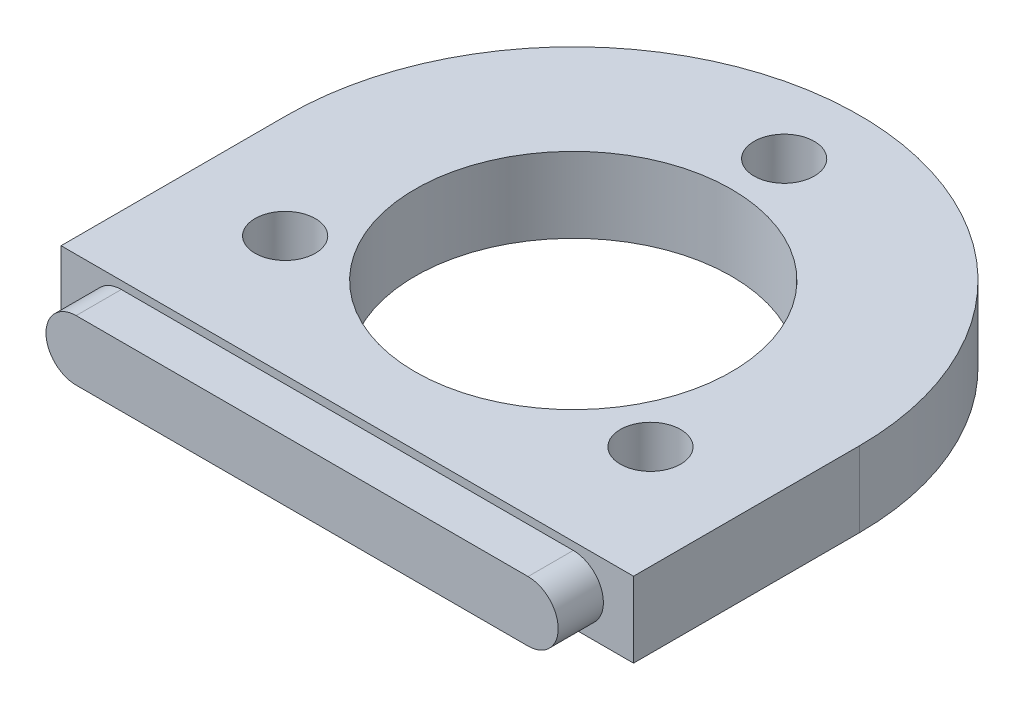
ISO-10303-21;
HEADER;
FILE_DESCRIPTION(('STEP AP214'),'2;1');
FILE_NAME('part.step','',(''),(''),'','','');
FILE_SCHEMA(('AUTOMOTIVE_DESIGN { 1 0 10303 214 1 1 1 1 }'));
ENDSEC;
DATA;
#1=APPLICATION_CONTEXT('core data for automotive mechanical design processes');
#2=APPLICATION_PROTOCOL_DEFINITION('international standard','automotive_design',2000,#1);
#3=PRODUCT_CONTEXT('',#1,'mechanical');
#4=PRODUCT('Part','Part','',(#3));
#5=PRODUCT_RELATED_PRODUCT_CATEGORY('part','',(#4));
#6=PRODUCT_DEFINITION_FORMATION('','',#4);
#7=PRODUCT_DEFINITION_CONTEXT('part definition',#1,'design');
#8=PRODUCT_DEFINITION('design','',#6,#7);
#9=PRODUCT_DEFINITION_SHAPE('','',#8);
#10=(LENGTH_UNIT() NAMED_UNIT(*) SI_UNIT(.MILLI.,.METRE.));
#11=(NAMED_UNIT(*) PLANE_ANGLE_UNIT() SI_UNIT($,.RADIAN.));
#12=(NAMED_UNIT(*) SI_UNIT($,.STERADIAN.) SOLID_ANGLE_UNIT());
#13=UNCERTAINTY_MEASURE_WITH_UNIT(LENGTH_MEASURE(1.E-05),#10,'distance_accuracy_value','');
#14=(GEOMETRIC_REPRESENTATION_CONTEXT(3) GLOBAL_UNCERTAINTY_ASSIGNED_CONTEXT((#13)) GLOBAL_UNIT_ASSIGNED_CONTEXT((#10,
#11,#12)) REPRESENTATION_CONTEXT('',''));
#15=CARTESIAN_POINT('',(0.,0.,0.));
#16=DIRECTION('',(0.,0.,1.));
#17=DIRECTION('',(1.,0.,0.));
#18=AXIS2_PLACEMENT_3D('',#15,#16,#17);
#19=CARTESIAN_POINT('',(19.,5.,15.));
#20=DIRECTION('',(0.,0.,-1.));
#21=DIRECTION('',(-1.,0.,0.));
#22=AXIS2_PLACEMENT_3D('',#19,#20,#21);
#23=PLANE('',#22);
#24=DIRECTION('',(1.,0.,0.));
#25=VECTOR('',#24,1.);
#26=CARTESIAN_POINT('',(19.,0.,15.));
#27=LINE('',#26,#25);
#28=CARTESIAN_POINT('',(-19.,0.,15.));
#29=VERTEX_POINT('',#28);
#30=CARTESIAN_POINT('',(19.,0.,15.));
#31=VERTEX_POINT('',#30);
#32=EDGE_CURVE('E140',#29,#31,#27,.T.);
#33=ORIENTED_EDGE('',*,*,#32,.T.);
#34=DIRECTION('',(0.,-1.,0.));
#35=VECTOR('',#34,1.);
#36=CARTESIAN_POINT('',(19.,5.,15.));
#37=LINE('',#36,#35);
#38=CARTESIAN_POINT('',(19.,5.,15.));
#39=VERTEX_POINT('',#38);
#40=EDGE_CURVE('E145',#39,#31,#37,.T.);
#41=ORIENTED_EDGE('',*,*,#40,.F.);
#42=DIRECTION('',(1.,0.,0.));
#43=VECTOR('',#42,1.);
#44=CARTESIAN_POINT('',(19.,5.,15.));
#45=LINE('',#44,#43);
#46=CARTESIAN_POINT('',(-19.,5.,15.));
#47=VERTEX_POINT('',#46);
#48=EDGE_CURVE('E134',#47,#39,#45,.T.);
#49=ORIENTED_EDGE('',*,*,#48,.F.);
#50=DIRECTION('',(0.,-1.,0.));
#51=VECTOR('',#50,1.);
#52=CARTESIAN_POINT('',(-19.,5.,15.));
#53=LINE('',#52,#51);
#54=EDGE_CURVE('E41',#47,#29,#53,.T.);
#55=ORIENTED_EDGE('',*,*,#54,.T.);
#56=EDGE_LOOP('',(#33,#41,#49,#55));
#57=FACE_BOUND('',#56,.T.);
#58=CARTESIAN_POINT('',(-15.,2.48203209659068,15.));
#59=DIRECTION('',(0.,0.,1.));
#60=DIRECTION('',(1.,0.,0.));
#61=AXIS2_PLACEMENT_3D('',#58,#59,#60);
#62=CIRCLE('',#61,2.);
#63=CARTESIAN_POINT('',(-15.,4.48203209659068,15.));
#64=VERTEX_POINT('',#63);
#65=CARTESIAN_POINT('',(-15.,0.482032096590681,15.));
#66=VERTEX_POINT('',#65);
#67=EDGE_CURVE('E49',#64,#66,#62,.T.);
#68=ORIENTED_EDGE('',*,*,#67,.F.);
#69=DIRECTION('',(-1.,0.,0.));
#70=VECTOR('',#69,1.);
#71=CARTESIAN_POINT('',(-15.,4.48203209659068,15.));
#72=LINE('',#71,#70);
#73=CARTESIAN_POINT('',(15.,4.48203209659068,15.));
#74=VERTEX_POINT('',#73);
#75=EDGE_CURVE('E53',#74,#64,#72,.T.);
#76=ORIENTED_EDGE('',*,*,#75,.F.);
#77=CARTESIAN_POINT('',(15.,2.48203209659068,15.));
#78=DIRECTION('',(0.,0.,1.));
#79=DIRECTION('',(1.,0.,0.));
#80=AXIS2_PLACEMENT_3D('',#77,#78,#79);
#81=CIRCLE('',#80,2.);
#82=CARTESIAN_POINT('',(15.,0.482032096590681,15.));
#83=VERTEX_POINT('',#82);
#84=EDGE_CURVE('E181',#83,#74,#81,.T.);
#85=ORIENTED_EDGE('',*,*,#84,.F.);
#86=DIRECTION('',(1.,0.,0.));
#87=VECTOR('',#86,1.);
#88=CARTESIAN_POINT('',(-15.,0.482032096590681,15.));
#89=LINE('',#88,#87);
#90=EDGE_CURVE('E179',#66,#83,#89,.T.);
#91=ORIENTED_EDGE('',*,*,#90,.F.);
#92=EDGE_LOOP('',(#68,#76,#85,#91));
#93=FACE_BOUND('',#92,.T.);
#94=ADVANCED_FACE('F32',(#57,#93),#23,.F.);
#95=CARTESIAN_POINT('',(0.,5.,0.));
#96=DIRECTION('',(0.,-1.,0.));
#97=DIRECTION('',(0.,0.,-1.));
#98=AXIS2_PLACEMENT_3D('',#95,#96,#97);
#99=CYLINDRICAL_SURFACE('',#98,19.);
#100=CARTESIAN_POINT('',(0.,0.,0.));
#101=DIRECTION('',(0.,1.,0.));
#102=DIRECTION('',(0.,0.,-1.));
#103=AXIS2_PLACEMENT_3D('',#100,#101,#102);
#104=CIRCLE('',#103,19.);
#105=CARTESIAN_POINT('',(19.,0.,0.));
#106=VERTEX_POINT('',#105);
#107=CARTESIAN_POINT('',(-19.,0.,0.));
#108=VERTEX_POINT('',#107);
#109=EDGE_CURVE('E119',#106,#108,#104,.T.);
#110=ORIENTED_EDGE('',*,*,#109,.T.);
#111=DIRECTION('',(0.,-1.,0.));
#112=VECTOR('',#111,1.);
#113=CARTESIAN_POINT('',(-19.,5.,0.));
#114=LINE('',#113,#112);
#115=CARTESIAN_POINT('',(-19.,5.,0.));
#116=VERTEX_POINT('',#115);
#117=EDGE_CURVE('E11',#116,#108,#114,.T.);
#118=ORIENTED_EDGE('',*,*,#117,.F.);
#119=CARTESIAN_POINT('',(0.,5.,0.));
#120=DIRECTION('',(0.,1.,0.));
#121=DIRECTION('',(0.,0.,-1.));
#122=AXIS2_PLACEMENT_3D('',#119,#120,#121);
#123=CIRCLE('',#122,19.);
#124=CARTESIAN_POINT('',(19.,5.,0.));
#125=VERTEX_POINT('',#124);
#126=EDGE_CURVE('E128',#125,#116,#123,.T.);
#127=ORIENTED_EDGE('',*,*,#126,.F.);
#128=DIRECTION('',(0.,-1.,0.));
#129=VECTOR('',#128,1.);
#130=CARTESIAN_POINT('',(19.,5.,0.));
#131=LINE('',#130,#129);
#132=EDGE_CURVE('E137',#125,#106,#131,.T.);
#133=ORIENTED_EDGE('',*,*,#132,.T.);
#134=EDGE_LOOP('',(#110,#118,#127,#133));
#135=FACE_BOUND('',#134,.T.);
#136=ADVANCED_FACE('F34',(#135),#99,.T.);
#137=CARTESIAN_POINT('',(-19.,5.,15.));
#138=DIRECTION('',(1.,0.,0.));
#139=DIRECTION('',(0.,0.,-1.));
#140=AXIS2_PLACEMENT_3D('',#137,#138,#139);
#141=PLANE('',#140);
#142=DIRECTION('',(0.,0.,1.));
#143=VECTOR('',#142,1.);
#144=CARTESIAN_POINT('',(-19.,0.,15.));
#145=LINE('',#144,#143);
#146=EDGE_CURVE('E122',#108,#29,#145,.T.);
#147=ORIENTED_EDGE('',*,*,#146,.T.);
#148=ORIENTED_EDGE('',*,*,#54,.F.);
#149=DIRECTION('',(0.,0.,1.));
#150=VECTOR('',#149,1.);
#151=CARTESIAN_POINT('',(-19.,5.,15.));
#152=LINE('',#151,#150);
#153=EDGE_CURVE('E131',#116,#47,#152,.T.);
#154=ORIENTED_EDGE('',*,*,#153,.F.);
#155=ORIENTED_EDGE('',*,*,#117,.T.);
#156=EDGE_LOOP('',(#147,#148,#154,#155));
#157=FACE_BOUND('',#156,.T.);
#158=ADVANCED_FACE('F196',(#157),#141,.F.);
#159=CARTESIAN_POINT('',(19.,5.,0.));
#160=DIRECTION('',(-1.,0.,0.));
#161=DIRECTION('',(0.,0.,1.));
#162=AXIS2_PLACEMENT_3D('',#159,#160,#161);
#163=PLANE('',#162);
#164=DIRECTION('',(0.,0.,-1.));
#165=VECTOR('',#164,1.);
#166=CARTESIAN_POINT('',(19.,0.,0.));
#167=LINE('',#166,#165);
#168=EDGE_CURVE('E132',#31,#106,#167,.T.);
#169=ORIENTED_EDGE('',*,*,#168,.T.);
#170=ORIENTED_EDGE('',*,*,#132,.F.);
#171=DIRECTION('',(0.,0.,-1.));
#172=VECTOR('',#171,1.);
#173=CARTESIAN_POINT('',(19.,5.,0.));
#174=LINE('',#173,#172);
#175=EDGE_CURVE('E136',#39,#125,#174,.T.);
#176=ORIENTED_EDGE('',*,*,#175,.F.);
#177=ORIENTED_EDGE('',*,*,#40,.T.);
#178=EDGE_LOOP('',(#169,#170,#176,#177));
#179=FACE_BOUND('',#178,.T.);
#180=ADVANCED_FACE('F199',(#179),#163,.F.);
#181=CARTESIAN_POINT('',(0.,5.,0.));
#182=DIRECTION('',(0.,-1.,0.));
#183=DIRECTION('',(0.,0.,-1.));
#184=AXIS2_PLACEMENT_3D('',#181,#182,#183);
#185=PLANE('',#184);
#186=CARTESIAN_POINT('',(12.1243556529821,5.,7.00000000000006));
#187=DIRECTION('',(0.,1.,0.));
#188=DIRECTION('',(-0.866025403784436,0.,-0.500000000000004));
#189=AXIS2_PLACEMENT_3D('',#186,#187,#188);
#190=CIRCLE('',#189,2.);
#191=CARTESIAN_POINT('',(10.3923048454132,5.,6.00000000000005));
#192=VERTEX_POINT('',#191);
#193=EDGE_CURVE('E156',#192,#192,#190,.T.);
#194=ORIENTED_EDGE('',*,*,#193,.F.);
#195=EDGE_LOOP('',(#194));
#196=FACE_BOUND('',#195,.T.);
#197=CARTESIAN_POINT('',(-12.1243556529822,5.,6.99999999999989));
#198=DIRECTION('',(0.,1.,0.));
#199=DIRECTION('',(0.866025403784443,0.,-0.499999999999992));
#200=AXIS2_PLACEMENT_3D('',#197,#198,#199);
#201=CIRCLE('',#200,2.);
#202=CARTESIAN_POINT('',(-10.3923048454133,5.,5.9999999999999));
#203=VERTEX_POINT('',#202);
#204=EDGE_CURVE('E161',#203,#203,#201,.T.);
#205=ORIENTED_EDGE('',*,*,#204,.F.);
#206=EDGE_LOOP('',(#205));
#207=FACE_BOUND('',#206,.T.);
#208=CARTESIAN_POINT('',(0.,5.,-14.));
#209=DIRECTION('',(0.,1.,0.));
#210=DIRECTION('',(0.,0.,1.));
#211=AXIS2_PLACEMENT_3D('',#208,#209,#210);
#212=CIRCLE('',#211,2.);
#213=CARTESIAN_POINT('',(0.,5.,-12.));
#214=VERTEX_POINT('',#213);
#215=EDGE_CURVE('E153',#214,#214,#212,.T.);
#216=ORIENTED_EDGE('',*,*,#215,.F.);
#217=EDGE_LOOP('',(#216));
#218=FACE_BOUND('',#217,.T.);
#219=CARTESIAN_POINT('',(0.,5.,0.));
#220=DIRECTION('',(0.,1.,0.));
#221=DIRECTION('',(0.,0.,1.));
#222=AXIS2_PLACEMENT_3D('',#219,#220,#221);
#223=CIRCLE('',#222,10.5);
#224=CARTESIAN_POINT('',(0.,5.,10.5));
#225=VERTEX_POINT('',#224);
#226=EDGE_CURVE('E152',#225,#225,#223,.T.);
#227=ORIENTED_EDGE('',*,*,#226,.F.);
#228=EDGE_LOOP('',(#227));
#229=FACE_BOUND('',#228,.T.);
#230=ORIENTED_EDGE('',*,*,#126,.T.);
#231=ORIENTED_EDGE('',*,*,#153,.T.);
#232=ORIENTED_EDGE('',*,*,#48,.T.);
#233=ORIENTED_EDGE('',*,*,#175,.T.);
#234=EDGE_LOOP('',(#230,#231,#232,#233));
#235=FACE_BOUND('',#234,.T.);
#236=ADVANCED_FACE('F206',(#196,#207,#218,#229,#235),#185,.F.);
#237=CARTESIAN_POINT('',(0.,0.,0.));
#238=DIRECTION('',(0.,-1.,0.));
#239=DIRECTION('',(0.,0.,-1.));
#240=AXIS2_PLACEMENT_3D('',#237,#238,#239);
#241=PLANE('',#240);
#242=CARTESIAN_POINT('',(12.1243556529821,0.,7.00000000000006));
#243=DIRECTION('',(0.,-1.,0.));
#244=DIRECTION('',(0.,0.,-1.));
#245=AXIS2_PLACEMENT_3D('',#242,#243,#244);
#246=CIRCLE('',#245,2.);
#247=CARTESIAN_POINT('',(12.1243556529821,0.,5.00000000000006));
#248=VERTEX_POINT('',#247);
#249=EDGE_CURVE('E36',#248,#248,#246,.T.);
#250=ORIENTED_EDGE('',*,*,#249,.F.);
#251=EDGE_LOOP('',(#250));
#252=FACE_BOUND('',#251,.T.);
#253=CARTESIAN_POINT('',(-12.1243556529822,0.,6.99999999999989));
#254=DIRECTION('',(0.,-1.,0.));
#255=DIRECTION('',(0.,0.,-1.));
#256=AXIS2_PLACEMENT_3D('',#253,#254,#255);
#257=CIRCLE('',#256,2.);
#258=CARTESIAN_POINT('',(-12.1243556529822,0.,4.99999999999989));
#259=VERTEX_POINT('',#258);
#260=EDGE_CURVE('E154',#259,#259,#257,.T.);
#261=ORIENTED_EDGE('',*,*,#260,.F.);
#262=EDGE_LOOP('',(#261));
#263=FACE_BOUND('',#262,.T.);
#264=CARTESIAN_POINT('',(0.,0.,-14.));
#265=DIRECTION('',(0.,-1.,0.));
#266=DIRECTION('',(0.,0.,-1.));
#267=AXIS2_PLACEMENT_3D('',#264,#265,#266);
#268=CIRCLE('',#267,2.);
#269=CARTESIAN_POINT('',(0.,0.,-16.));
#270=VERTEX_POINT('',#269);
#271=EDGE_CURVE('E150',#270,#270,#268,.T.);
#272=ORIENTED_EDGE('',*,*,#271,.F.);
#273=EDGE_LOOP('',(#272));
#274=FACE_BOUND('',#273,.T.);
#275=CARTESIAN_POINT('',(0.,0.,0.));
#276=DIRECTION('',(0.,1.,0.));
#277=DIRECTION('',(0.,0.,1.));
#278=AXIS2_PLACEMENT_3D('',#275,#276,#277);
#279=CIRCLE('',#278,10.5);
#280=CARTESIAN_POINT('',(0.,0.,10.5));
#281=VERTEX_POINT('',#280);
#282=EDGE_CURVE('E170',#281,#281,#279,.T.);
#283=ORIENTED_EDGE('',*,*,#282,.T.);
#284=EDGE_LOOP('',(#283));
#285=FACE_BOUND('',#284,.T.);
#286=ORIENTED_EDGE('',*,*,#109,.F.);
#287=ORIENTED_EDGE('',*,*,#168,.F.);
#288=ORIENTED_EDGE('',*,*,#32,.F.);
#289=ORIENTED_EDGE('',*,*,#146,.F.);
#290=EDGE_LOOP('',(#286,#287,#288,#289));
#291=FACE_BOUND('',#290,.T.);
#292=ADVANCED_FACE('F216',(#252,#263,#274,#285,#291),#241,.T.);
#293=CARTESIAN_POINT('',(-15.,2.48203209659068,18.));
#294=DIRECTION('',(0.,0.,-1.));
#295=DIRECTION('',(-1.,0.,0.));
#296=AXIS2_PLACEMENT_3D('',#293,#294,#295);
#297=CYLINDRICAL_SURFACE('',#296,2.);
#298=ORIENTED_EDGE('',*,*,#67,.T.);
#299=DIRECTION('',(0.,0.,-1.));
#300=VECTOR('',#299,1.);
#301=CARTESIAN_POINT('',(-15.,0.482032096590681,18.));
#302=LINE('',#301,#300);
#303=CARTESIAN_POINT('',(-15.,0.482032096590681,18.));
#304=VERTEX_POINT('',#303);
#305=EDGE_CURVE('E102',#304,#66,#302,.T.);
#306=ORIENTED_EDGE('',*,*,#305,.F.);
#307=CARTESIAN_POINT('',(-15.,2.48203209659068,18.));
#308=DIRECTION('',(0.,0.,1.));
#309=DIRECTION('',(1.,0.,0.));
#310=AXIS2_PLACEMENT_3D('',#307,#308,#309);
#311=CIRCLE('',#310,2.);
#312=CARTESIAN_POINT('',(-15.,4.48203209659068,18.));
#313=VERTEX_POINT('',#312);
#314=EDGE_CURVE('E108',#313,#304,#311,.T.);
#315=ORIENTED_EDGE('',*,*,#314,.F.);
#316=DIRECTION('',(0.,0.,-1.));
#317=VECTOR('',#316,1.);
#318=CARTESIAN_POINT('',(-15.,4.48203209659068,18.));
#319=LINE('',#318,#317);
#320=EDGE_CURVE('E177',#313,#64,#319,.T.);
#321=ORIENTED_EDGE('',*,*,#320,.T.);
#322=EDGE_LOOP('',(#298,#306,#315,#321));
#323=FACE_BOUND('',#322,.T.);
#324=ADVANCED_FACE('F118',(#323),#297,.T.);
#325=CARTESIAN_POINT('',(-15.,0.482032096590681,18.));
#326=DIRECTION('',(0.,1.,0.));
#327=DIRECTION('',(0.,0.,1.));
#328=AXIS2_PLACEMENT_3D('',#325,#326,#327);
#329=PLANE('',#328);
#330=ORIENTED_EDGE('',*,*,#90,.T.);
#331=DIRECTION('',(0.,0.,-1.));
#332=VECTOR('',#331,1.);
#333=CARTESIAN_POINT('',(15.,0.482032096590681,18.));
#334=LINE('',#333,#332);
#335=CARTESIAN_POINT('',(15.,0.482032096590681,18.));
#336=VERTEX_POINT('',#335);
#337=EDGE_CURVE('E104',#336,#83,#334,.T.);
#338=ORIENTED_EDGE('',*,*,#337,.F.);
#339=DIRECTION('',(1.,0.,0.));
#340=VECTOR('',#339,1.);
#341=CARTESIAN_POINT('',(-15.,0.482032096590681,18.));
#342=LINE('',#341,#340);
#343=EDGE_CURVE('E97',#304,#336,#342,.T.);
#344=ORIENTED_EDGE('',*,*,#343,.F.);
#345=ORIENTED_EDGE('',*,*,#305,.T.);
#346=EDGE_LOOP('',(#330,#338,#344,#345));
#347=FACE_BOUND('',#346,.T.);
#348=ADVANCED_FACE('F100',(#347),#329,.F.);
#349=CARTESIAN_POINT('',(15.,2.48203209659068,18.));
#350=DIRECTION('',(0.,0.,-1.));
#351=DIRECTION('',(-1.,0.,0.));
#352=AXIS2_PLACEMENT_3D('',#349,#350,#351);
#353=CYLINDRICAL_SURFACE('',#352,2.);
#354=ORIENTED_EDGE('',*,*,#84,.T.);
#355=DIRECTION('',(0.,0.,-1.));
#356=VECTOR('',#355,1.);
#357=CARTESIAN_POINT('',(15.,4.48203209659068,18.));
#358=LINE('',#357,#356);
#359=CARTESIAN_POINT('',(15.,4.48203209659068,18.));
#360=VERTEX_POINT('',#359);
#361=EDGE_CURVE('E124',#360,#74,#358,.T.);
#362=ORIENTED_EDGE('',*,*,#361,.F.);
#363=CARTESIAN_POINT('',(15.,2.48203209659068,18.));
#364=DIRECTION('',(0.,0.,1.));
#365=DIRECTION('',(1.,0.,0.));
#366=AXIS2_PLACEMENT_3D('',#363,#364,#365);
#367=CIRCLE('',#366,2.);
#368=EDGE_CURVE('E107',#336,#360,#367,.T.);
#369=ORIENTED_EDGE('',*,*,#368,.F.);
#370=ORIENTED_EDGE('',*,*,#337,.T.);
#371=EDGE_LOOP('',(#354,#362,#369,#370));
#372=FACE_BOUND('',#371,.T.);
#373=ADVANCED_FACE('F189',(#372),#353,.T.);
#374=CARTESIAN_POINT('',(-15.,4.48203209659068,18.));
#375=DIRECTION('',(0.,-1.,0.));
#376=DIRECTION('',(0.,0.,-1.));
#377=AXIS2_PLACEMENT_3D('',#374,#375,#376);
#378=PLANE('',#377);
#379=ORIENTED_EDGE('',*,*,#75,.T.);
#380=ORIENTED_EDGE('',*,*,#320,.F.);
#381=DIRECTION('',(-1.,0.,0.));
#382=VECTOR('',#381,1.);
#383=CARTESIAN_POINT('',(-15.,4.48203209659068,18.));
#384=LINE('',#383,#382);
#385=EDGE_CURVE('E113',#360,#313,#384,.T.);
#386=ORIENTED_EDGE('',*,*,#385,.F.);
#387=ORIENTED_EDGE('',*,*,#361,.T.);
#388=EDGE_LOOP('',(#379,#380,#386,#387));
#389=FACE_BOUND('',#388,.T.);
#390=ADVANCED_FACE('F187',(#389),#378,.F.);
#391=CARTESIAN_POINT('',(-15.,2.48203209659068,18.));
#392=DIRECTION('',(0.,0.,1.));
#393=DIRECTION('',(1.,0.,0.));
#394=AXIS2_PLACEMENT_3D('',#391,#392,#393);
#395=PLANE('',#394);
#396=ORIENTED_EDGE('',*,*,#314,.T.);
#397=ORIENTED_EDGE('',*,*,#343,.T.);
#398=ORIENTED_EDGE('',*,*,#368,.T.);
#399=ORIENTED_EDGE('',*,*,#385,.T.);
#400=EDGE_LOOP('',(#396,#397,#398,#399));
#401=FACE_BOUND('',#400,.T.);
#402=ADVANCED_FACE('F111',(#401),#395,.T.);
#403=CARTESIAN_POINT('',(0.,0.,0.));
#404=DIRECTION('',(0.,1.,0.));
#405=DIRECTION('',(0.,0.,1.));
#406=AXIS2_PLACEMENT_3D('',#403,#404,#405);
#407=CYLINDRICAL_SURFACE('',#406,10.5);
#408=ORIENTED_EDGE('',*,*,#282,.F.);
#409=EDGE_LOOP('',(#408));
#410=FACE_BOUND('',#409,.T.);
#411=ORIENTED_EDGE('',*,*,#226,.T.);
#412=EDGE_LOOP('',(#411));
#413=FACE_BOUND('',#412,.T.);
#414=ADVANCED_FACE('F240',(#410,#413),#407,.F.);
#415=CARTESIAN_POINT('',(0.,-5.,-14.));
#416=DIRECTION('',(0.,1.,0.));
#417=DIRECTION('',(0.,0.,1.));
#418=AXIS2_PLACEMENT_3D('',#415,#416,#417);
#419=CYLINDRICAL_SURFACE('',#418,2.);
#420=ORIENTED_EDGE('',*,*,#271,.T.);
#421=EDGE_LOOP('',(#420));
#422=FACE_BOUND('',#421,.T.);
#423=ORIENTED_EDGE('',*,*,#215,.T.);
#424=EDGE_LOOP('',(#423));
#425=FACE_BOUND('',#424,.T.);
#426=ADVANCED_FACE('F243',(#422,#425),#419,.F.);
#427=CARTESIAN_POINT('',(-12.1243556529822,-5.,6.99999999999989));
#428=DIRECTION('',(0.,1.,0.));
#429=DIRECTION('',(0.,0.,1.));
#430=AXIS2_PLACEMENT_3D('',#427,#428,#429);
#431=CYLINDRICAL_SURFACE('',#430,2.);
#432=ORIENTED_EDGE('',*,*,#260,.T.);
#433=EDGE_LOOP('',(#432));
#434=FACE_BOUND('',#433,.T.);
#435=ORIENTED_EDGE('',*,*,#204,.T.);
#436=EDGE_LOOP('',(#435));
#437=FACE_BOUND('',#436,.T.);
#438=ADVANCED_FACE('F247',(#434,#437),#431,.F.);
#439=CARTESIAN_POINT('',(12.1243556529821,-5.,7.00000000000006));
#440=DIRECTION('',(0.,1.,0.));
#441=DIRECTION('',(0.,0.,1.));
#442=AXIS2_PLACEMENT_3D('',#439,#440,#441);
#443=CYLINDRICAL_SURFACE('',#442,2.);
#444=ORIENTED_EDGE('',*,*,#249,.T.);
#445=EDGE_LOOP('',(#444));
#446=FACE_BOUND('',#445,.T.);
#447=ORIENTED_EDGE('',*,*,#193,.T.);
#448=EDGE_LOOP('',(#447));
#449=FACE_BOUND('',#448,.T.);
#450=ADVANCED_FACE('F251',(#446,#449),#443,.F.);
#451=CLOSED_SHELL('',(#94,#136,#158,#180,#236,#292,#324,#348,#373,#390,#402,#414,#426,#438,#450));
#452=MANIFOLD_SOLID_BREP('B2',#451);
#453=ADVANCED_BREP_SHAPE_REPRESENTATION('',(#18,#452),#14);
#454=SHAPE_DEFINITION_REPRESENTATION(#9,#453);
ENDSEC;
END-ISO-10303-21;
